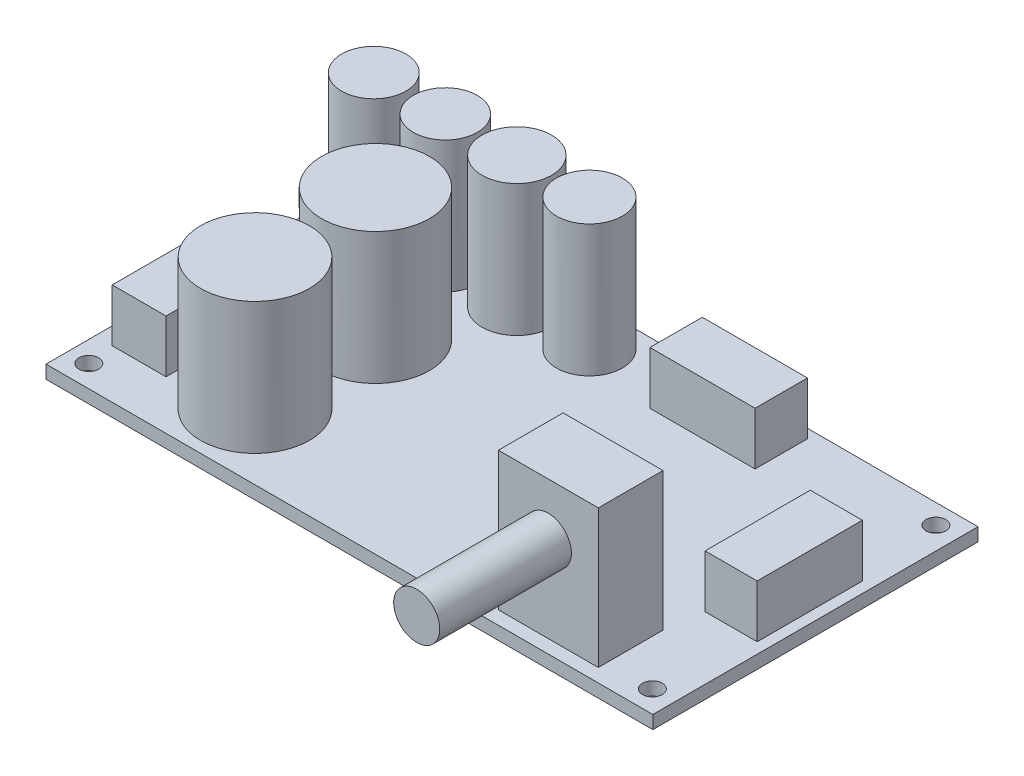
ISO-10303-21;
HEADER;
FILE_DESCRIPTION(('STEP AP214'),'2;1');
FILE_NAME('part.step','',(''),(''),'','','');
FILE_SCHEMA(('AUTOMOTIVE_DESIGN { 1 0 10303 214 1 1 1 1 }'));
ENDSEC;
DATA;
#1=APPLICATION_CONTEXT('core data for automotive mechanical design processes');
#2=APPLICATION_PROTOCOL_DEFINITION('international standard','automotive_design',2000,#1);
#3=PRODUCT_CONTEXT('',#1,'mechanical');
#4=PRODUCT('Part','Part','',(#3));
#5=PRODUCT_RELATED_PRODUCT_CATEGORY('part','',(#4));
#6=PRODUCT_DEFINITION_FORMATION('','',#4);
#7=PRODUCT_DEFINITION_CONTEXT('part definition',#1,'design');
#8=PRODUCT_DEFINITION('design','',#6,#7);
#9=PRODUCT_DEFINITION_SHAPE('','',#8);
#10=(LENGTH_UNIT() NAMED_UNIT(*) SI_UNIT(.MILLI.,.METRE.));
#11=(NAMED_UNIT(*) PLANE_ANGLE_UNIT() SI_UNIT($,.RADIAN.));
#12=(NAMED_UNIT(*) SI_UNIT($,.STERADIAN.) SOLID_ANGLE_UNIT());
#13=UNCERTAINTY_MEASURE_WITH_UNIT(LENGTH_MEASURE(1.E-05),#10,'distance_accuracy_value','');
#14=(GEOMETRIC_REPRESENTATION_CONTEXT(3) GLOBAL_UNCERTAINTY_ASSIGNED_CONTEXT((#13)) GLOBAL_UNIT_ASSIGNED_CONTEXT((#10,
#11,#12)) REPRESENTATION_CONTEXT('',''));
#15=CARTESIAN_POINT('',(0.,0.,0.));
#16=DIRECTION('',(0.,0.,1.));
#17=DIRECTION('',(1.,0.,0.));
#18=AXIS2_PLACEMENT_3D('',#15,#16,#17);
#19=CARTESIAN_POINT('',(0.,2.,0.));
#20=DIRECTION('',(0.,-1.,0.));
#21=DIRECTION('',(0.,0.,-1.));
#22=AXIS2_PLACEMENT_3D('',#19,#20,#21);
#23=PLANE('',#22);
#24=CARTESIAN_POINT('',(39.3032224539351,2.,-43.2596794848796));
#25=DIRECTION('',(0.,1.,0.));
#26=DIRECTION('',(0.,0.,1.));
#27=AXIS2_PLACEMENT_3D('',#24,#25,#26);
#28=CIRCLE('',#27,5.00626696308557);
#29=CARTESIAN_POINT('',(39.3032224539351,2.,-38.253412521794));
#30=VERTEX_POINT('',#29);
#31=EDGE_CURVE('E306',#30,#30,#28,.T.);
#32=ORIENTED_EDGE('',*,*,#31,.F.);
#33=EDGE_LOOP('',(#32));
#34=FACE_BOUND('',#33,.T.);
#35=CARTESIAN_POINT('',(28.275737120317,2.,-43.2596794848796));
#36=DIRECTION('',(0.,1.,0.));
#37=DIRECTION('',(0.,0.,1.));
#38=AXIS2_PLACEMENT_3D('',#35,#36,#37);
#39=CIRCLE('',#38,5.28960392137158);
#40=CARTESIAN_POINT('',(28.275737120317,2.,-37.970075563508));
#41=VERTEX_POINT('',#40);
#42=EDGE_CURVE('E309',#41,#41,#39,.T.);
#43=ORIENTED_EDGE('',*,*,#42,.F.);
#44=EDGE_LOOP('',(#43));
#45=FACE_BOUND('',#44,.T.);
#46=CARTESIAN_POINT('',(17.4088462333051,2.,-43.2596794848796));
#47=DIRECTION('',(0.,1.,0.));
#48=DIRECTION('',(0.,0.,1.));
#49=AXIS2_PLACEMENT_3D('',#46,#47,#48);
#50=CIRCLE('',#49,4.86636211814024);
#51=CARTESIAN_POINT('',(17.4088462333051,2.,-38.3933173667394));
#52=VERTEX_POINT('',#51);
#53=EDGE_CURVE('E312',#52,#52,#50,.T.);
#54=ORIENTED_EDGE('',*,*,#53,.F.);
#55=EDGE_LOOP('',(#54));
#56=FACE_BOUND('',#55,.T.);
#57=CARTESIAN_POINT('',(6.54195534629316,2.,-43.2596794848796));
#58=DIRECTION('',(0.,1.,0.));
#59=DIRECTION('',(0.,0.,1.));
#60=AXIS2_PLACEMENT_3D('',#57,#58,#59);
#61=CIRCLE('',#60,4.88663565414446);
#62=CARTESIAN_POINT('',(6.54195534629316,2.,-38.3730438307351));
#63=VERTEX_POINT('',#62);
#64=EDGE_CURVE('E315',#63,#63,#61,.T.);
#65=ORIENTED_EDGE('',*,*,#64,.F.);
#66=EDGE_LOOP('',(#65));
#67=FACE_BOUND('',#66,.T.);
#68=CARTESIAN_POINT('',(21.7941831917424,2.,-28.2648132629545));
#69=DIRECTION('',(0.,1.,0.));
#70=DIRECTION('',(0.,0.,1.));
#71=AXIS2_PLACEMENT_3D('',#68,#69,#70);
#72=CIRCLE('',#71,8.19285699774402);
#73=CARTESIAN_POINT('',(21.7941831917424,2.,-20.0719562652105));
#74=VERTEX_POINT('',#73);
#75=EDGE_CURVE('E318',#74,#74,#72,.T.);
#76=ORIENTED_EDGE('',*,*,#75,.F.);
#77=EDGE_LOOP('',(#76));
#78=FACE_BOUND('',#77,.T.);
#79=CARTESIAN_POINT('',(21.7941831917424,2.,-9.96047002436539));
#80=DIRECTION('',(0.,1.,0.));
#81=DIRECTION('',(0.,0.,1.));
#82=AXIS2_PLACEMENT_3D('',#79,#80,#81);
#83=CIRCLE('',#82,8.26216698803987);
#84=CARTESIAN_POINT('',(21.7941831917424,2.,-1.69830303632552));
#85=VERTEX_POINT('',#84);
#86=EDGE_CURVE('E321',#85,#85,#83,.T.);
#87=ORIENTED_EDGE('',*,*,#86,.F.);
#88=EDGE_LOOP('',(#87));
#89=FACE_BOUND('',#88,.T.);
#90=DIRECTION('',(0.,0.,1.));
#91=VECTOR('',#90,1.);
#92=CARTESIAN_POINT('',(82.64782543229,2.,-33.4703322658946));
#93=LINE('',#92,#91);
#94=CARTESIAN_POINT('',(82.64782543229,2.,-33.4703322658946));
#95=VERTEX_POINT('',#94);
#96=CARTESIAN_POINT('',(82.64782543229,2.,-17.4908386370606));
#97=VERTEX_POINT('',#96);
#98=EDGE_CURVE('E324',#95,#97,#93,.T.);
#99=ORIENTED_EDGE('',*,*,#98,.F.);
#100=DIRECTION('',(-1.,0.,0.));
#101=VECTOR('',#100,1.);
#102=CARTESIAN_POINT('',(82.64782543229,2.,-33.4703322658946));
#103=LINE('',#102,#101);
#104=CARTESIAN_POINT('',(90.5594965449374,2.,-33.4703322658946));
#105=VERTEX_POINT('',#104);
#106=EDGE_CURVE('E56',#105,#95,#103,.T.);
#107=ORIENTED_EDGE('',*,*,#106,.F.);
#108=DIRECTION('',(0.,0.,-1.));
#109=VECTOR('',#108,1.);
#110=CARTESIAN_POINT('',(90.5594965449374,2.,-33.4703322658946));
#111=LINE('',#110,#109);
#112=CARTESIAN_POINT('',(90.5594965449374,2.,-17.4908386370606));
#113=VERTEX_POINT('',#112);
#114=EDGE_CURVE('E330',#113,#105,#111,.T.);
#115=ORIENTED_EDGE('',*,*,#114,.F.);
#116=DIRECTION('',(1.,0.,0.));
#117=VECTOR('',#116,1.);
#118=CARTESIAN_POINT('',(82.64782543229,2.,-17.4908386370606));
#119=LINE('',#118,#117);
#120=EDGE_CURVE('E327',#97,#113,#119,.T.);
#121=ORIENTED_EDGE('',*,*,#120,.F.);
#122=EDGE_LOOP('',(#99,#107,#115,#121));
#123=FACE_BOUND('',#122,.T.);
#124=DIRECTION('',(0.,0.,1.));
#125=VECTOR('',#124,1.);
#126=CARTESIAN_POINT('',(2.61143252259727,2.,-23.6201436271693));
#127=LINE('',#126,#125);
#128=CARTESIAN_POINT('',(2.61143252259727,2.,-23.6201436271693));
#129=VERTEX_POINT('',#128);
#130=CARTESIAN_POINT('',(2.61143252259727,2.,-7.44690784271631));
#131=VERTEX_POINT('',#130);
#132=EDGE_CURVE('E345',#129,#131,#127,.T.);
#133=ORIENTED_EDGE('',*,*,#132,.F.);
#134=DIRECTION('',(-1.,0.,0.));
#135=VECTOR('',#134,1.);
#136=CARTESIAN_POINT('',(2.61143252259727,2.,-23.6201436271693));
#137=LINE('',#136,#135);
#138=CARTESIAN_POINT('',(10.7894984362221,2.,-23.6201436271693));
#139=VERTEX_POINT('',#138);
#140=EDGE_CURVE('E354',#139,#129,#137,.T.);
#141=ORIENTED_EDGE('',*,*,#140,.F.);
#142=DIRECTION('',(0.,0.,-1.));
#143=VECTOR('',#142,1.);
#144=CARTESIAN_POINT('',(10.7894984362221,2.,-23.6201436271693));
#145=LINE('',#144,#143);
#146=CARTESIAN_POINT('',(10.7894984362221,2.,-7.44690784271631));
#147=VERTEX_POINT('',#146);
#148=EDGE_CURVE('E351',#147,#139,#145,.T.);
#149=ORIENTED_EDGE('',*,*,#148,.F.);
#150=DIRECTION('',(1.,0.,0.));
#151=VECTOR('',#150,1.);
#152=CARTESIAN_POINT('',(2.61143252259727,2.,-7.44690784271631));
#153=LINE('',#152,#151);
#154=EDGE_CURVE('E348',#131,#147,#153,.T.);
#155=ORIENTED_EDGE('',*,*,#154,.F.);
#156=EDGE_LOOP('',(#133,#141,#149,#155));
#157=FACE_BOUND('',#156,.T.);
#158=DIRECTION('',(0.,0.,1.));
#159=VECTOR('',#158,1.);
#160=CARTESIAN_POINT('',(0.,2.,0.));
#161=LINE('',#160,#159);
#162=CARTESIAN_POINT('',(0.,2.,-49.4));
#163=VERTEX_POINT('',#162);
#164=CARTESIAN_POINT('',(0.,2.,0.));
#165=VERTEX_POINT('',#164);
#166=EDGE_CURVE('E376',#163,#165,#161,.T.);
#167=ORIENTED_EDGE('',*,*,#166,.T.);
#168=DIRECTION('',(1.,0.,0.));
#169=VECTOR('',#168,1.);
#170=CARTESIAN_POINT('',(0.,2.,0.));
#171=LINE('',#170,#169);
#172=CARTESIAN_POINT('',(92.2,2.,0.));
#173=VERTEX_POINT('',#172);
#174=EDGE_CURVE('E379',#165,#173,#171,.T.);
#175=ORIENTED_EDGE('',*,*,#174,.T.);
#176=DIRECTION('',(0.,0.,-1.));
#177=VECTOR('',#176,1.);
#178=CARTESIAN_POINT('',(92.2,2.,0.));
#179=LINE('',#178,#177);
#180=CARTESIAN_POINT('',(92.2,2.,-49.4));
#181=VERTEX_POINT('',#180);
#182=EDGE_CURVE('E382',#173,#181,#179,.T.);
#183=ORIENTED_EDGE('',*,*,#182,.T.);
#184=DIRECTION('',(-1.,0.,0.));
#185=VECTOR('',#184,1.);
#186=CARTESIAN_POINT('',(0.,2.,-49.4));
#187=LINE('',#186,#185);
#188=EDGE_CURVE('E384',#181,#163,#187,.T.);
#189=ORIENTED_EDGE('',*,*,#188,.T.);
#190=EDGE_LOOP('',(#167,#175,#183,#189));
#191=FACE_BOUND('',#190,.T.);
#192=CARTESIAN_POINT('',(3.17395868291502,2.,-3.33170554922467));
#193=DIRECTION('',(0.,1.,0.));
#194=DIRECTION('',(0.,0.,1.));
#195=AXIS2_PLACEMENT_3D('',#192,#193,#194);
#196=CIRCLE('',#195,1.5);
#197=CARTESIAN_POINT('',(3.17395868291502,2.,-1.83170554922467));
#198=VERTEX_POINT('',#197);
#199=EDGE_CURVE('E370',#198,#198,#196,.T.);
#200=ORIENTED_EDGE('',*,*,#199,.F.);
#201=EDGE_LOOP('',(#200));
#202=FACE_BOUND('',#201,.T.);
#203=CARTESIAN_POINT('',(88.7993970505717,2.,-46.4060095753167));
#204=DIRECTION('',(0.,1.,0.));
#205=DIRECTION('',(0.,0.,1.));
#206=AXIS2_PLACEMENT_3D('',#203,#204,#205);
#207=CIRCLE('',#206,1.5);
#208=CARTESIAN_POINT('',(88.7993970505717,2.,-44.9060095753167));
#209=VERTEX_POINT('',#208);
#210=EDGE_CURVE('E364',#209,#209,#207,.T.);
#211=ORIENTED_EDGE('',*,*,#210,.F.);
#212=EDGE_LOOP('',(#211));
#213=FACE_BOUND('',#212,.T.);
#214=CARTESIAN_POINT('',(88.7993970505717,2.,-3.33170554922467));
#215=DIRECTION('',(0.,1.,0.));
#216=DIRECTION('',(0.,0.,1.));
#217=AXIS2_PLACEMENT_3D('',#214,#215,#216);
#218=CIRCLE('',#217,1.5);
#219=CARTESIAN_POINT('',(88.7993970505717,2.,-1.83170554922467));
#220=VERTEX_POINT('',#219);
#221=EDGE_CURVE('E358',#220,#220,#218,.T.);
#222=ORIENTED_EDGE('',*,*,#221,.F.);
#223=EDGE_LOOP('',(#222));
#224=FACE_BOUND('',#223,.T.);
#225=DIRECTION('',(0.,0.,1.));
#226=VECTOR('',#225,1.);
#227=CARTESIAN_POINT('',(51.6901467301312,2.,-48.0224224645311));
#228=LINE('',#227,#226);
#229=CARTESIAN_POINT('',(51.6901467301312,2.,-48.0224224645311));
#230=VERTEX_POINT('',#229);
#231=CARTESIAN_POINT('',(51.6901467301312,2.,-40.06295574366));
#232=VERTEX_POINT('',#231);
#233=EDGE_CURVE('E333',#230,#232,#228,.T.);
#234=ORIENTED_EDGE('',*,*,#233,.F.);
#235=DIRECTION('',(-1.,0.,0.));
#236=VECTOR('',#235,1.);
#237=CARTESIAN_POINT('',(51.6901467301312,2.,-48.0224224645311));
#238=LINE('',#237,#236);
#239=CARTESIAN_POINT('',(67.6705432353549,2.,-48.0224224645311));
#240=VERTEX_POINT('',#239);
#241=EDGE_CURVE('E342',#240,#230,#238,.T.);
#242=ORIENTED_EDGE('',*,*,#241,.F.);
#243=DIRECTION('',(0.,0.,-1.));
#244=VECTOR('',#243,1.);
#245=CARTESIAN_POINT('',(67.6705432353549,2.,-48.0224224645311));
#246=LINE('',#245,#244);
#247=CARTESIAN_POINT('',(67.6705432353549,2.,-40.06295574366));
#248=VERTEX_POINT('',#247);
#249=EDGE_CURVE('E339',#248,#240,#246,.T.);
#250=ORIENTED_EDGE('',*,*,#249,.F.);
#251=DIRECTION('',(1.,0.,0.));
#252=VECTOR('',#251,1.);
#253=CARTESIAN_POINT('',(51.6901467301312,2.,-40.06295574366));
#254=LINE('',#253,#252);
#255=EDGE_CURVE('E336',#232,#248,#254,.T.);
#256=ORIENTED_EDGE('',*,*,#255,.F.);
#257=EDGE_LOOP('',(#234,#242,#250,#256));
#258=FACE_BOUND('',#257,.T.);
#259=DIRECTION('',(0.,0.,1.));
#260=VECTOR('',#259,1.);
#261=CARTESIAN_POINT('',(66.6968726537264,2.,-11.8685424395724));
#262=LINE('',#261,#260);
#263=CARTESIAN_POINT('',(66.6968726537264,2.,-11.8685424395724));
#264=VERTEX_POINT('',#263);
#265=CARTESIAN_POINT('',(66.6968726537264,2.,-2.03848519042144));
#266=VERTEX_POINT('',#265);
#267=EDGE_CURVE('E290',#264,#266,#262,.T.);
#268=ORIENTED_EDGE('',*,*,#267,.F.);
#269=DIRECTION('',(-1.,0.,0.));
#270=VECTOR('',#269,1.);
#271=CARTESIAN_POINT('',(66.6968726537264,2.,-11.8685424395724));
#272=LINE('',#271,#270);
#273=CARTESIAN_POINT('',(81.8744810464154,2.,-11.8685424395724));
#274=VERTEX_POINT('',#273);
#275=EDGE_CURVE('E48',#274,#264,#272,.T.);
#276=ORIENTED_EDGE('',*,*,#275,.F.);
#277=DIRECTION('',(0.,0.,-1.));
#278=VECTOR('',#277,1.);
#279=CARTESIAN_POINT('',(81.8744810464154,2.,-11.8685424395724));
#280=LINE('',#279,#278);
#281=CARTESIAN_POINT('',(81.8744810464154,2.,-2.03848519042144));
#282=VERTEX_POINT('',#281);
#283=EDGE_CURVE('E303',#282,#274,#280,.T.);
#284=ORIENTED_EDGE('',*,*,#283,.F.);
#285=DIRECTION('',(1.,0.,0.));
#286=VECTOR('',#285,1.);
#287=CARTESIAN_POINT('',(66.6968726537264,2.,-2.03848519042144));
#288=LINE('',#287,#286);
#289=EDGE_CURVE('E300',#266,#282,#288,.T.);
#290=ORIENTED_EDGE('',*,*,#289,.F.);
#291=EDGE_LOOP('',(#268,#276,#284,#290));
#292=FACE_BOUND('',#291,.T.);
#293=ADVANCED_FACE('F33',(#34,#45,#56,#67,#78,#89,#123,#157,#191,#202,#213,#224,#258,#292),#23,.F.);
#294=CARTESIAN_POINT('',(0.,0.,0.));
#295=DIRECTION('',(0.,-1.,0.));
#296=DIRECTION('',(0.,0.,-1.));
#297=AXIS2_PLACEMENT_3D('',#294,#295,#296);
#298=PLANE('',#297);
#299=CARTESIAN_POINT('',(88.7993970505717,0.,-46.4060095753167));
#300=DIRECTION('',(0.,1.,0.));
#301=DIRECTION('',(0.,0.,1.));
#302=AXIS2_PLACEMENT_3D('',#299,#300,#301);
#303=CIRCLE('',#302,1.5);
#304=CARTESIAN_POINT('',(88.7993970505717,0.,-44.9060095753167));
#305=VERTEX_POINT('',#304);
#306=EDGE_CURVE('E361',#305,#305,#303,.T.);
#307=ORIENTED_EDGE('',*,*,#306,.T.);
#308=EDGE_LOOP('',(#307));
#309=FACE_BOUND('',#308,.T.);
#310=DIRECTION('',(0.,0.,1.));
#311=VECTOR('',#310,1.);
#312=CARTESIAN_POINT('',(0.,0.,0.));
#313=LINE('',#312,#311);
#314=CARTESIAN_POINT('',(0.,0.,-49.4));
#315=VERTEX_POINT('',#314);
#316=CARTESIAN_POINT('',(0.,0.,0.));
#317=VERTEX_POINT('',#316);
#318=EDGE_CURVE('E373',#315,#317,#313,.T.);
#319=ORIENTED_EDGE('',*,*,#318,.F.);
#320=DIRECTION('',(-1.,0.,0.));
#321=VECTOR('',#320,1.);
#322=CARTESIAN_POINT('',(0.,0.,-49.4));
#323=LINE('',#322,#321);
#324=CARTESIAN_POINT('',(92.2,0.,-49.4));
#325=VERTEX_POINT('',#324);
#326=EDGE_CURVE('E380',#325,#315,#323,.T.);
#327=ORIENTED_EDGE('',*,*,#326,.F.);
#328=DIRECTION('',(0.,0.,-1.));
#329=VECTOR('',#328,1.);
#330=CARTESIAN_POINT('',(92.2,0.,0.));
#331=LINE('',#330,#329);
#332=CARTESIAN_POINT('',(92.2,0.,0.));
#333=VERTEX_POINT('',#332);
#334=EDGE_CURVE('E391',#333,#325,#331,.T.);
#335=ORIENTED_EDGE('',*,*,#334,.F.);
#336=DIRECTION('',(1.,0.,0.));
#337=VECTOR('',#336,1.);
#338=CARTESIAN_POINT('',(0.,0.,0.));
#339=LINE('',#338,#337);
#340=EDGE_CURVE('E389',#317,#333,#339,.T.);
#341=ORIENTED_EDGE('',*,*,#340,.F.);
#342=EDGE_LOOP('',(#319,#327,#335,#341));
#343=FACE_BOUND('',#342,.T.);
#344=CARTESIAN_POINT('',(3.17395868291502,0.,-3.33170554922467));
#345=DIRECTION('',(0.,1.,0.));
#346=DIRECTION('',(0.,0.,1.));
#347=AXIS2_PLACEMENT_3D('',#344,#345,#346);
#348=CIRCLE('',#347,1.5);
#349=CARTESIAN_POINT('',(3.17395868291502,0.,-1.83170554922467));
#350=VERTEX_POINT('',#349);
#351=EDGE_CURVE('E367',#350,#350,#348,.T.);
#352=ORIENTED_EDGE('',*,*,#351,.T.);
#353=EDGE_LOOP('',(#352));
#354=FACE_BOUND('',#353,.T.);
#355=CARTESIAN_POINT('',(88.7993970505717,0.,-3.33170554922467));
#356=DIRECTION('',(0.,1.,0.));
#357=DIRECTION('',(0.,0.,1.));
#358=AXIS2_PLACEMENT_3D('',#355,#356,#357);
#359=CIRCLE('',#358,1.5);
#360=CARTESIAN_POINT('',(88.7993970505717,0.,-1.83170554922467));
#361=VERTEX_POINT('',#360);
#362=EDGE_CURVE('E357',#361,#361,#359,.T.);
#363=ORIENTED_EDGE('',*,*,#362,.T.);
#364=EDGE_LOOP('',(#363));
#365=FACE_BOUND('',#364,.T.);
#366=ADVANCED_FACE('F409',(#309,#343,#354,#365),#298,.T.);
#367=CARTESIAN_POINT('',(0.,2.,0.));
#368=DIRECTION('',(1.,0.,0.));
#369=DIRECTION('',(0.,0.,-1.));
#370=AXIS2_PLACEMENT_3D('',#367,#368,#369);
#371=PLANE('',#370);
#372=ORIENTED_EDGE('',*,*,#318,.T.);
#373=DIRECTION('',(0.,-1.,0.));
#374=VECTOR('',#373,1.);
#375=CARTESIAN_POINT('',(0.,2.,0.));
#376=LINE('',#375,#374);
#377=EDGE_CURVE('E11',#165,#317,#376,.T.);
#378=ORIENTED_EDGE('',*,*,#377,.F.);
#379=ORIENTED_EDGE('',*,*,#166,.F.);
#380=DIRECTION('',(0.,-1.,0.));
#381=VECTOR('',#380,1.);
#382=CARTESIAN_POINT('',(0.,2.,-49.4));
#383=LINE('',#382,#381);
#384=EDGE_CURVE('E386',#163,#315,#383,.T.);
#385=ORIENTED_EDGE('',*,*,#384,.T.);
#386=EDGE_LOOP('',(#372,#378,#379,#385));
#387=FACE_BOUND('',#386,.T.);
#388=ADVANCED_FACE('F35',(#387),#371,.F.);
#389=CARTESIAN_POINT('',(0.,2.,0.));
#390=DIRECTION('',(0.,0.,-1.));
#391=DIRECTION('',(-1.,0.,0.));
#392=AXIS2_PLACEMENT_3D('',#389,#390,#391);
#393=PLANE('',#392);
#394=ORIENTED_EDGE('',*,*,#340,.T.);
#395=DIRECTION('',(0.,-1.,0.));
#396=VECTOR('',#395,1.);
#397=CARTESIAN_POINT('',(92.2,2.,0.));
#398=LINE('',#397,#396);
#399=EDGE_CURVE('E41',#173,#333,#398,.T.);
#400=ORIENTED_EDGE('',*,*,#399,.F.);
#401=ORIENTED_EDGE('',*,*,#174,.F.);
#402=ORIENTED_EDGE('',*,*,#377,.T.);
#403=EDGE_LOOP('',(#394,#400,#401,#402));
#404=FACE_BOUND('',#403,.T.);
#405=ADVANCED_FACE('F420',(#404),#393,.F.);
#406=CARTESIAN_POINT('',(92.2,2.,0.));
#407=DIRECTION('',(-1.,0.,0.));
#408=DIRECTION('',(0.,0.,1.));
#409=AXIS2_PLACEMENT_3D('',#406,#407,#408);
#410=PLANE('',#409);
#411=ORIENTED_EDGE('',*,*,#334,.T.);
#412=DIRECTION('',(0.,-1.,0.));
#413=VECTOR('',#412,1.);
#414=CARTESIAN_POINT('',(92.2,2.,-49.4));
#415=LINE('',#414,#413);
#416=EDGE_CURVE('E396',#181,#325,#415,.T.);
#417=ORIENTED_EDGE('',*,*,#416,.F.);
#418=ORIENTED_EDGE('',*,*,#182,.F.);
#419=ORIENTED_EDGE('',*,*,#399,.T.);
#420=EDGE_LOOP('',(#411,#417,#418,#419));
#421=FACE_BOUND('',#420,.T.);
#422=ADVANCED_FACE('F403',(#421),#410,.F.);
#423=CARTESIAN_POINT('',(0.,2.,-49.4));
#424=DIRECTION('',(0.,0.,1.));
#425=DIRECTION('',(1.,0.,0.));
#426=AXIS2_PLACEMENT_3D('',#423,#424,#425);
#427=PLANE('',#426);
#428=ORIENTED_EDGE('',*,*,#326,.T.);
#429=ORIENTED_EDGE('',*,*,#384,.F.);
#430=ORIENTED_EDGE('',*,*,#188,.F.);
#431=ORIENTED_EDGE('',*,*,#416,.T.);
#432=EDGE_LOOP('',(#428,#429,#430,#431));
#433=FACE_BOUND('',#432,.T.);
#434=ADVANCED_FACE('F413',(#433),#427,.F.);
#435=CARTESIAN_POINT('',(3.17395868291502,2.,-3.33170554922467));
#436=DIRECTION('',(0.,-1.,0.));
#437=DIRECTION('',(0.,0.,-1.));
#438=AXIS2_PLACEMENT_3D('',#435,#436,#437);
#439=CYLINDRICAL_SURFACE('',#438,1.5);
#440=ORIENTED_EDGE('',*,*,#199,.T.);
#441=EDGE_LOOP('',(#440));
#442=FACE_BOUND('',#441,.T.);
#443=ORIENTED_EDGE('',*,*,#351,.F.);
#444=EDGE_LOOP('',(#443));
#445=FACE_BOUND('',#444,.T.);
#446=ADVANCED_FACE('F438',(#442,#445),#439,.F.);
#447=CARTESIAN_POINT('',(88.7993970505717,2.,-46.4060095753167));
#448=DIRECTION('',(0.,-1.,0.));
#449=DIRECTION('',(0.,0.,-1.));
#450=AXIS2_PLACEMENT_3D('',#447,#448,#449);
#451=CYLINDRICAL_SURFACE('',#450,1.5);
#452=ORIENTED_EDGE('',*,*,#210,.T.);
#453=EDGE_LOOP('',(#452));
#454=FACE_BOUND('',#453,.T.);
#455=ORIENTED_EDGE('',*,*,#306,.F.);
#456=EDGE_LOOP('',(#455));
#457=FACE_BOUND('',#456,.T.);
#458=ADVANCED_FACE('F445',(#454,#457),#451,.F.);
#459=CARTESIAN_POINT('',(88.7993970505717,2.,-3.33170554922467));
#460=DIRECTION('',(0.,-1.,0.));
#461=DIRECTION('',(0.,0.,-1.));
#462=AXIS2_PLACEMENT_3D('',#459,#460,#461);
#463=CYLINDRICAL_SURFACE('',#462,1.5);
#464=ORIENTED_EDGE('',*,*,#221,.T.);
#465=EDGE_LOOP('',(#464));
#466=FACE_BOUND('',#465,.T.);
#467=ORIENTED_EDGE('',*,*,#362,.F.);
#468=EDGE_LOOP('',(#467));
#469=FACE_BOUND('',#468,.T.);
#470=ADVANCED_FACE('F450',(#466,#469),#463,.F.);
#471=CARTESIAN_POINT('',(2.61143252259727,10.,-7.44690784271631));
#472=DIRECTION('',(0.,0.,1.));
#473=DIRECTION('',(1.,0.,0.));
#474=AXIS2_PLACEMENT_3D('',#471,#472,#473);
#475=PLANE('',#474);
#476=ORIENTED_EDGE('',*,*,#154,.T.);
#477=DIRECTION('',(0.,-1.,0.));
#478=VECTOR('',#477,1.);
#479=CARTESIAN_POINT('',(10.7894984362221,10.,-7.44690784271631));
#480=LINE('',#479,#478);
#481=CARTESIAN_POINT('',(10.7894984362221,10.,-7.44690784271631));
#482=VERTEX_POINT('',#481);
#483=EDGE_CURVE('E291',#482,#147,#480,.T.);
#484=ORIENTED_EDGE('',*,*,#483,.F.);
#485=DIRECTION('',(-1.,0.,0.));
#486=VECTOR('',#485,1.);
#487=CARTESIAN_POINT('',(2.61143252259727,10.,-7.44690784271631));
#488=LINE('',#487,#486);
#489=CARTESIAN_POINT('',(2.61143252259727,10.,-7.44690784271631));
#490=VERTEX_POINT('',#489);
#491=EDGE_CURVE('E283',#482,#490,#488,.T.);
#492=ORIENTED_EDGE('',*,*,#491,.T.);
#493=DIRECTION('',(0.,-1.,0.));
#494=VECTOR('',#493,1.);
#495=CARTESIAN_POINT('',(2.61143252259727,10.,-7.44690784271631));
#496=LINE('',#495,#494);
#497=EDGE_CURVE('E287',#490,#131,#496,.T.);
#498=ORIENTED_EDGE('',*,*,#497,.T.);
#499=EDGE_LOOP('',(#476,#484,#492,#498));
#500=FACE_BOUND('',#499,.T.);
#501=ADVANCED_FACE('F459',(#500),#475,.T.);
#502=CARTESIAN_POINT('',(2.61143252259727,10.,-23.6201436271693));
#503=DIRECTION('',(0.,0.,-1.));
#504=DIRECTION('',(-1.,0.,0.));
#505=AXIS2_PLACEMENT_3D('',#502,#503,#504);
#506=PLANE('',#505);
#507=ORIENTED_EDGE('',*,*,#140,.T.);
#508=DIRECTION('',(0.,-1.,0.));
#509=VECTOR('',#508,1.);
#510=CARTESIAN_POINT('',(2.61143252259727,10.,-23.6201436271693));
#511=LINE('',#510,#509);
#512=CARTESIAN_POINT('',(2.61143252259727,10.,-23.6201436271693));
#513=VERTEX_POINT('',#512);
#514=EDGE_CURVE('E286',#513,#129,#511,.T.);
#515=ORIENTED_EDGE('',*,*,#514,.F.);
#516=DIRECTION('',(1.,0.,0.));
#517=VECTOR('',#516,1.);
#518=CARTESIAN_POINT('',(2.61143252259727,10.,-23.6201436271693));
#519=LINE('',#518,#517);
#520=CARTESIAN_POINT('',(10.7894984362221,10.,-23.6201436271693));
#521=VERTEX_POINT('',#520);
#522=EDGE_CURVE('E277',#513,#521,#519,.T.);
#523=ORIENTED_EDGE('',*,*,#522,.T.);
#524=DIRECTION('',(0.,-1.,0.));
#525=VECTOR('',#524,1.);
#526=CARTESIAN_POINT('',(10.7894984362221,10.,-23.6201436271693));
#527=LINE('',#526,#525);
#528=EDGE_CURVE('E294',#521,#139,#527,.T.);
#529=ORIENTED_EDGE('',*,*,#528,.T.);
#530=EDGE_LOOP('',(#507,#515,#523,#529));
#531=FACE_BOUND('',#530,.T.);
#532=ADVANCED_FACE('F465',(#531),#506,.T.);
#533=CARTESIAN_POINT('',(2.61143252259727,10.,-7.44690784271631));
#534=DIRECTION('',(-1.,0.,0.));
#535=DIRECTION('',(0.,0.,1.));
#536=AXIS2_PLACEMENT_3D('',#533,#534,#535);
#537=PLANE('',#536);
#538=ORIENTED_EDGE('',*,*,#132,.T.);
#539=ORIENTED_EDGE('',*,*,#497,.F.);
#540=DIRECTION('',(0.,0.,-1.));
#541=VECTOR('',#540,1.);
#542=CARTESIAN_POINT('',(2.61143252259727,10.,-7.44690784271631));
#543=LINE('',#542,#541);
#544=EDGE_CURVE('E266',#490,#513,#543,.T.);
#545=ORIENTED_EDGE('',*,*,#544,.T.);
#546=ORIENTED_EDGE('',*,*,#514,.T.);
#547=EDGE_LOOP('',(#538,#539,#545,#546));
#548=FACE_BOUND('',#547,.T.);
#549=ADVANCED_FACE('F469',(#548),#537,.T.);
#550=CARTESIAN_POINT('',(10.7894984362221,10.,-7.44690784271631));
#551=DIRECTION('',(1.,0.,0.));
#552=DIRECTION('',(0.,0.,-1.));
#553=AXIS2_PLACEMENT_3D('',#550,#551,#552);
#554=PLANE('',#553);
#555=ORIENTED_EDGE('',*,*,#148,.T.);
#556=ORIENTED_EDGE('',*,*,#528,.F.);
#557=DIRECTION('',(0.,0.,1.));
#558=VECTOR('',#557,1.);
#559=CARTESIAN_POINT('',(10.7894984362221,10.,-7.44690784271631));
#560=LINE('',#559,#558);
#561=EDGE_CURVE('E280',#521,#482,#560,.T.);
#562=ORIENTED_EDGE('',*,*,#561,.T.);
#563=ORIENTED_EDGE('',*,*,#483,.T.);
#564=EDGE_LOOP('',(#555,#556,#562,#563));
#565=FACE_BOUND('',#564,.T.);
#566=ADVANCED_FACE('F472',(#565),#554,.T.);
#567=CARTESIAN_POINT('',(0.,10.,0.));
#568=DIRECTION('',(0.,-1.,0.));
#569=DIRECTION('',(0.,0.,-1.));
#570=AXIS2_PLACEMENT_3D('',#567,#568,#569);
#571=PLANE('',#570);
#572=ORIENTED_EDGE('',*,*,#544,.F.);
#573=ORIENTED_EDGE('',*,*,#491,.F.);
#574=ORIENTED_EDGE('',*,*,#561,.F.);
#575=ORIENTED_EDGE('',*,*,#522,.F.);
#576=EDGE_LOOP('',(#572,#573,#574,#575));
#577=FACE_BOUND('',#576,.T.);
#578=ADVANCED_FACE('F478',(#577),#571,.F.);
#579=CARTESIAN_POINT('',(51.6901467301312,10.,-40.06295574366));
#580=DIRECTION('',(0.,0.,1.));
#581=DIRECTION('',(1.,0.,0.));
#582=AXIS2_PLACEMENT_3D('',#579,#580,#581);
#583=PLANE('',#582);
#584=ORIENTED_EDGE('',*,*,#255,.T.);
#585=DIRECTION('',(0.,-1.,0.));
#586=VECTOR('',#585,1.);
#587=CARTESIAN_POINT('',(67.6705432353549,10.,-40.06295574366));
#588=LINE('',#587,#586);
#589=CARTESIAN_POINT('',(67.6705432353549,10.,-40.06295574366));
#590=VERTEX_POINT('',#589);
#591=EDGE_CURVE('E267',#590,#248,#588,.T.);
#592=ORIENTED_EDGE('',*,*,#591,.F.);
#593=DIRECTION('',(-1.,0.,0.));
#594=VECTOR('',#593,1.);
#595=CARTESIAN_POINT('',(51.6901467301312,10.,-40.06295574366));
#596=LINE('',#595,#594);
#597=CARTESIAN_POINT('',(51.6901467301312,10.,-40.06295574366));
#598=VERTEX_POINT('',#597);
#599=EDGE_CURVE('E259',#590,#598,#596,.T.);
#600=ORIENTED_EDGE('',*,*,#599,.T.);
#601=DIRECTION('',(0.,-1.,0.));
#602=VECTOR('',#601,1.);
#603=CARTESIAN_POINT('',(51.6901467301312,10.,-40.06295574366));
#604=LINE('',#603,#602);
#605=EDGE_CURVE('E263',#598,#232,#604,.T.);
#606=ORIENTED_EDGE('',*,*,#605,.T.);
#607=EDGE_LOOP('',(#584,#592,#600,#606));
#608=FACE_BOUND('',#607,.T.);
#609=ADVANCED_FACE('F483',(#608),#583,.T.);
#610=CARTESIAN_POINT('',(51.6901467301312,10.,-48.0224224645311));
#611=DIRECTION('',(0.,0.,-1.));
#612=DIRECTION('',(-1.,0.,0.));
#613=AXIS2_PLACEMENT_3D('',#610,#611,#612);
#614=PLANE('',#613);
#615=ORIENTED_EDGE('',*,*,#241,.T.);
#616=DIRECTION('',(0.,-1.,0.));
#617=VECTOR('',#616,1.);
#618=CARTESIAN_POINT('',(51.6901467301312,10.,-48.0224224645311));
#619=LINE('',#618,#617);
#620=CARTESIAN_POINT('',(51.6901467301312,10.,-48.0224224645311));
#621=VERTEX_POINT('',#620);
#622=EDGE_CURVE('E262',#621,#230,#619,.T.);
#623=ORIENTED_EDGE('',*,*,#622,.F.);
#624=DIRECTION('',(1.,0.,0.));
#625=VECTOR('',#624,1.);
#626=CARTESIAN_POINT('',(51.6901467301312,10.,-48.0224224645311));
#627=LINE('',#626,#625);
#628=CARTESIAN_POINT('',(67.6705432353549,10.,-48.0224224645311));
#629=VERTEX_POINT('',#628);
#630=EDGE_CURVE('E253',#621,#629,#627,.T.);
#631=ORIENTED_EDGE('',*,*,#630,.T.);
#632=DIRECTION('',(0.,-1.,0.));
#633=VECTOR('',#632,1.);
#634=CARTESIAN_POINT('',(67.6705432353549,10.,-48.0224224645311));
#635=LINE('',#634,#633);
#636=EDGE_CURVE('E270',#629,#240,#635,.T.);
#637=ORIENTED_EDGE('',*,*,#636,.T.);
#638=EDGE_LOOP('',(#615,#623,#631,#637));
#639=FACE_BOUND('',#638,.T.);
#640=ADVANCED_FACE('F489',(#639),#614,.T.);
#641=CARTESIAN_POINT('',(51.6901467301312,10.,-40.06295574366));
#642=DIRECTION('',(-1.,0.,0.));
#643=DIRECTION('',(0.,0.,1.));
#644=AXIS2_PLACEMENT_3D('',#641,#642,#643);
#645=PLANE('',#644);
#646=ORIENTED_EDGE('',*,*,#233,.T.);
#647=ORIENTED_EDGE('',*,*,#605,.F.);
#648=DIRECTION('',(0.,0.,-1.));
#649=VECTOR('',#648,1.);
#650=CARTESIAN_POINT('',(51.6901467301312,10.,-40.06295574366));
#651=LINE('',#650,#649);
#652=EDGE_CURVE('E242',#598,#621,#651,.T.);
#653=ORIENTED_EDGE('',*,*,#652,.T.);
#654=ORIENTED_EDGE('',*,*,#622,.T.);
#655=EDGE_LOOP('',(#646,#647,#653,#654));
#656=FACE_BOUND('',#655,.T.);
#657=ADVANCED_FACE('F485',(#656),#645,.T.);
#658=CARTESIAN_POINT('',(67.6705432353549,10.,-40.06295574366));
#659=DIRECTION('',(1.,0.,0.));
#660=DIRECTION('',(0.,0.,-1.));
#661=AXIS2_PLACEMENT_3D('',#658,#659,#660);
#662=PLANE('',#661);
#663=ORIENTED_EDGE('',*,*,#249,.T.);
#664=ORIENTED_EDGE('',*,*,#636,.F.);
#665=DIRECTION('',(0.,0.,1.));
#666=VECTOR('',#665,1.);
#667=CARTESIAN_POINT('',(67.6705432353549,10.,-40.06295574366));
#668=LINE('',#667,#666);
#669=EDGE_CURVE('E256',#629,#590,#668,.T.);
#670=ORIENTED_EDGE('',*,*,#669,.T.);
#671=ORIENTED_EDGE('',*,*,#591,.T.);
#672=EDGE_LOOP('',(#663,#664,#670,#671));
#673=FACE_BOUND('',#672,.T.);
#674=ADVANCED_FACE('F488',(#673),#662,.T.);
#675=CARTESIAN_POINT('',(0.,10.,0.));
#676=DIRECTION('',(0.,-1.,0.));
#677=DIRECTION('',(0.,0.,-1.));
#678=AXIS2_PLACEMENT_3D('',#675,#676,#677);
#679=PLANE('',#678);
#680=ORIENTED_EDGE('',*,*,#652,.F.);
#681=ORIENTED_EDGE('',*,*,#599,.F.);
#682=ORIENTED_EDGE('',*,*,#669,.F.);
#683=ORIENTED_EDGE('',*,*,#630,.F.);
#684=EDGE_LOOP('',(#680,#681,#682,#683));
#685=FACE_BOUND('',#684,.T.);
#686=ADVANCED_FACE('F496',(#685),#679,.F.);
#687=CARTESIAN_POINT('',(82.64782543229,10.,-17.4908386370606));
#688=DIRECTION('',(0.,0.,1.));
#689=DIRECTION('',(1.,0.,0.));
#690=AXIS2_PLACEMENT_3D('',#687,#688,#689);
#691=PLANE('',#690);
#692=ORIENTED_EDGE('',*,*,#120,.T.);
#693=DIRECTION('',(0.,-1.,0.));
#694=VECTOR('',#693,1.);
#695=CARTESIAN_POINT('',(90.5594965449374,10.,-17.4908386370606));
#696=LINE('',#695,#694);
#697=CARTESIAN_POINT('',(90.5594965449374,10.,-17.4908386370606));
#698=VERTEX_POINT('',#697);
#699=EDGE_CURVE('E243',#698,#113,#696,.T.);
#700=ORIENTED_EDGE('',*,*,#699,.F.);
#701=DIRECTION('',(-1.,0.,0.));
#702=VECTOR('',#701,1.);
#703=CARTESIAN_POINT('',(82.64782543229,10.,-17.4908386370606));
#704=LINE('',#703,#702);
#705=CARTESIAN_POINT('',(82.64782543229,10.,-17.4908386370606));
#706=VERTEX_POINT('',#705);
#707=EDGE_CURVE('E235',#698,#706,#704,.T.);
#708=ORIENTED_EDGE('',*,*,#707,.T.);
#709=DIRECTION('',(0.,-1.,0.));
#710=VECTOR('',#709,1.);
#711=CARTESIAN_POINT('',(82.64782543229,10.,-17.4908386370606));
#712=LINE('',#711,#710);
#713=EDGE_CURVE('E239',#706,#97,#712,.T.);
#714=ORIENTED_EDGE('',*,*,#713,.T.);
#715=EDGE_LOOP('',(#692,#700,#708,#714));
#716=FACE_BOUND('',#715,.T.);
#717=ADVANCED_FACE('F503',(#716),#691,.T.);
#718=CARTESIAN_POINT('',(82.64782543229,10.,-33.4703322658946));
#719=DIRECTION('',(0.,0.,-1.));
#720=DIRECTION('',(-1.,0.,0.));
#721=AXIS2_PLACEMENT_3D('',#718,#719,#720);
#722=PLANE('',#721);
#723=ORIENTED_EDGE('',*,*,#106,.T.);
#724=DIRECTION('',(0.,-1.,0.));
#725=VECTOR('',#724,1.);
#726=CARTESIAN_POINT('',(82.64782543229,10.,-33.4703322658946));
#727=LINE('',#726,#725);
#728=CARTESIAN_POINT('',(82.64782543229,10.,-33.4703322658946));
#729=VERTEX_POINT('',#728);
#730=EDGE_CURVE('E238',#729,#95,#727,.T.);
#731=ORIENTED_EDGE('',*,*,#730,.F.);
#732=DIRECTION('',(1.,0.,0.));
#733=VECTOR('',#732,1.);
#734=CARTESIAN_POINT('',(82.64782543229,10.,-33.4703322658946));
#735=LINE('',#734,#733);
#736=CARTESIAN_POINT('',(90.5594965449374,10.,-33.4703322658946));
#737=VERTEX_POINT('',#736);
#738=EDGE_CURVE('E229',#729,#737,#735,.T.);
#739=ORIENTED_EDGE('',*,*,#738,.T.);
#740=DIRECTION('',(0.,-1.,0.));
#741=VECTOR('',#740,1.);
#742=CARTESIAN_POINT('',(90.5594965449374,10.,-33.4703322658946));
#743=LINE('',#742,#741);
#744=EDGE_CURVE('E246',#737,#105,#743,.T.);
#745=ORIENTED_EDGE('',*,*,#744,.T.);
#746=EDGE_LOOP('',(#723,#731,#739,#745));
#747=FACE_BOUND('',#746,.T.);
#748=ADVANCED_FACE('F509',(#747),#722,.T.);
#749=CARTESIAN_POINT('',(82.64782543229,10.,-17.4908386370606));
#750=DIRECTION('',(-1.,0.,0.));
#751=DIRECTION('',(0.,0.,1.));
#752=AXIS2_PLACEMENT_3D('',#749,#750,#751);
#753=PLANE('',#752);
#754=ORIENTED_EDGE('',*,*,#98,.T.);
#755=ORIENTED_EDGE('',*,*,#713,.F.);
#756=DIRECTION('',(0.,0.,-1.));
#757=VECTOR('',#756,1.);
#758=CARTESIAN_POINT('',(82.64782543229,10.,-17.4908386370606));
#759=LINE('',#758,#757);
#760=EDGE_CURVE('E226',#706,#729,#759,.T.);
#761=ORIENTED_EDGE('',*,*,#760,.T.);
#762=ORIENTED_EDGE('',*,*,#730,.T.);
#763=EDGE_LOOP('',(#754,#755,#761,#762));
#764=FACE_BOUND('',#763,.T.);
#765=ADVANCED_FACE('F505',(#764),#753,.T.);
#766=CARTESIAN_POINT('',(90.5594965449374,10.,-17.4908386370606));
#767=DIRECTION('',(1.,0.,0.));
#768=DIRECTION('',(0.,0.,-1.));
#769=AXIS2_PLACEMENT_3D('',#766,#767,#768);
#770=PLANE('',#769);
#771=ORIENTED_EDGE('',*,*,#114,.T.);
#772=ORIENTED_EDGE('',*,*,#744,.F.);
#773=DIRECTION('',(0.,0.,1.));
#774=VECTOR('',#773,1.);
#775=CARTESIAN_POINT('',(90.5594965449374,10.,-17.4908386370606));
#776=LINE('',#775,#774);
#777=EDGE_CURVE('E232',#737,#698,#776,.T.);
#778=ORIENTED_EDGE('',*,*,#777,.T.);
#779=ORIENTED_EDGE('',*,*,#699,.T.);
#780=EDGE_LOOP('',(#771,#772,#778,#779));
#781=FACE_BOUND('',#780,.T.);
#782=ADVANCED_FACE('F508',(#781),#770,.T.);
#783=CARTESIAN_POINT('',(0.,10.,0.));
#784=DIRECTION('',(0.,-1.,0.));
#785=DIRECTION('',(0.,0.,-1.));
#786=AXIS2_PLACEMENT_3D('',#783,#784,#785);
#787=PLANE('',#786);
#788=ORIENTED_EDGE('',*,*,#760,.F.);
#789=ORIENTED_EDGE('',*,*,#707,.F.);
#790=ORIENTED_EDGE('',*,*,#777,.F.);
#791=ORIENTED_EDGE('',*,*,#738,.F.);
#792=EDGE_LOOP('',(#788,#789,#790,#791));
#793=FACE_BOUND('',#792,.T.);
#794=ADVANCED_FACE('F516',(#793),#787,.F.);
#795=CARTESIAN_POINT('',(21.7941831917424,22.,-28.2648132629545));
#796=DIRECTION('',(0.,-1.,0.));
#797=DIRECTION('',(0.,0.,-1.));
#798=AXIS2_PLACEMENT_3D('',#795,#796,#797);
#799=CYLINDRICAL_SURFACE('',#798,8.19285699774402);
#800=CARTESIAN_POINT('',(21.7941831917424,22.,-28.2648132629545));
#801=DIRECTION('',(0.,-1.,0.));
#802=DIRECTION('',(0.,0.,-1.));
#803=AXIS2_PLACEMENT_3D('',#800,#801,#802);
#804=CIRCLE('',#803,8.19285699774402);
#805=CARTESIAN_POINT('',(21.7941831917424,22.,-36.4576702606985));
#806=VERTEX_POINT('',#805);
#807=EDGE_CURVE('E223',#806,#806,#804,.T.);
#808=ORIENTED_EDGE('',*,*,#807,.T.);
#809=EDGE_LOOP('',(#808));
#810=FACE_BOUND('',#809,.T.);
#811=ORIENTED_EDGE('',*,*,#75,.T.);
#812=EDGE_LOOP('',(#811));
#813=FACE_BOUND('',#812,.T.);
#814=ADVANCED_FACE('F523',(#810,#813),#799,.T.);
#815=CARTESIAN_POINT('',(21.7941831917424,22.,-28.2648132629545));
#816=DIRECTION('',(0.,-1.,0.));
#817=DIRECTION('',(0.,0.,-1.));
#818=AXIS2_PLACEMENT_3D('',#815,#816,#817);
#819=PLANE('',#818);
#820=ORIENTED_EDGE('',*,*,#807,.F.);
#821=EDGE_LOOP('',(#820));
#822=FACE_BOUND('',#821,.T.);
#823=ADVANCED_FACE('F527',(#822),#819,.F.);
#824=CARTESIAN_POINT('',(21.7941831917424,22.,-9.96047002436539));
#825=DIRECTION('',(0.,-1.,0.));
#826=DIRECTION('',(0.,0.,-1.));
#827=AXIS2_PLACEMENT_3D('',#824,#825,#826);
#828=CYLINDRICAL_SURFACE('',#827,8.26216698803987);
#829=CARTESIAN_POINT('',(21.7941831917424,22.,-9.96047002436539));
#830=DIRECTION('',(0.,-1.,0.));
#831=DIRECTION('',(0.,0.,-1.));
#832=AXIS2_PLACEMENT_3D('',#829,#830,#831);
#833=CIRCLE('',#832,8.26216698803987);
#834=CARTESIAN_POINT('',(21.7941831917424,22.,-18.2226370124053));
#835=VERTEX_POINT('',#834);
#836=EDGE_CURVE('E220',#835,#835,#833,.T.);
#837=ORIENTED_EDGE('',*,*,#836,.T.);
#838=EDGE_LOOP('',(#837));
#839=FACE_BOUND('',#838,.T.);
#840=ORIENTED_EDGE('',*,*,#86,.T.);
#841=EDGE_LOOP('',(#840));
#842=FACE_BOUND('',#841,.T.);
#843=ADVANCED_FACE('F531',(#839,#842),#828,.T.);
#844=CARTESIAN_POINT('',(21.7941831917424,22.,-9.96047002436539));
#845=DIRECTION('',(0.,-1.,0.));
#846=DIRECTION('',(0.,0.,-1.));
#847=AXIS2_PLACEMENT_3D('',#844,#845,#846);
#848=PLANE('',#847);
#849=ORIENTED_EDGE('',*,*,#836,.F.);
#850=EDGE_LOOP('',(#849));
#851=FACE_BOUND('',#850,.T.);
#852=ADVANCED_FACE('F535',(#851),#848,.F.);
#853=CARTESIAN_POINT('',(6.54195534629316,22.,-43.2596794848796));
#854=DIRECTION('',(0.,-1.,0.));
#855=DIRECTION('',(0.,0.,-1.));
#856=AXIS2_PLACEMENT_3D('',#853,#854,#855);
#857=CYLINDRICAL_SURFACE('',#856,4.88663565414446);
#858=CARTESIAN_POINT('',(6.54195534629316,22.,-43.2596794848796));
#859=DIRECTION('',(0.,-1.,0.));
#860=DIRECTION('',(0.,0.,-1.));
#861=AXIS2_PLACEMENT_3D('',#858,#859,#860);
#862=CIRCLE('',#861,4.88663565414446);
#863=CARTESIAN_POINT('',(6.54195534629316,22.,-48.1463151390241));
#864=VERTEX_POINT('',#863);
#865=EDGE_CURVE('E217',#864,#864,#862,.T.);
#866=ORIENTED_EDGE('',*,*,#865,.T.);
#867=EDGE_LOOP('',(#866));
#868=FACE_BOUND('',#867,.T.);
#869=ORIENTED_EDGE('',*,*,#64,.T.);
#870=EDGE_LOOP('',(#869));
#871=FACE_BOUND('',#870,.T.);
#872=ADVANCED_FACE('F539',(#868,#871),#857,.T.);
#873=CARTESIAN_POINT('',(6.54195534629316,22.,-43.2596794848796));
#874=DIRECTION('',(0.,-1.,0.));
#875=DIRECTION('',(0.,0.,-1.));
#876=AXIS2_PLACEMENT_3D('',#873,#874,#875);
#877=PLANE('',#876);
#878=ORIENTED_EDGE('',*,*,#865,.F.);
#879=EDGE_LOOP('',(#878));
#880=FACE_BOUND('',#879,.T.);
#881=ADVANCED_FACE('F543',(#880),#877,.F.);
#882=CARTESIAN_POINT('',(17.4088462333051,22.,-43.2596794848796));
#883=DIRECTION('',(0.,-1.,0.));
#884=DIRECTION('',(0.,0.,-1.));
#885=AXIS2_PLACEMENT_3D('',#882,#883,#884);
#886=CYLINDRICAL_SURFACE('',#885,4.86636211814023);
#887=CARTESIAN_POINT('',(17.4088462333051,22.,-43.2596794848796));
#888=DIRECTION('',(0.,-1.,0.));
#889=DIRECTION('',(0.,0.,-1.));
#890=AXIS2_PLACEMENT_3D('',#887,#888,#889);
#891=CIRCLE('',#890,4.86636211814023);
#892=CARTESIAN_POINT('',(17.4088462333051,22.,-48.1260416030198));
#893=VERTEX_POINT('',#892);
#894=EDGE_CURVE('E214',#893,#893,#891,.T.);
#895=ORIENTED_EDGE('',*,*,#894,.T.);
#896=EDGE_LOOP('',(#895));
#897=FACE_BOUND('',#896,.T.);
#898=ORIENTED_EDGE('',*,*,#53,.T.);
#899=EDGE_LOOP('',(#898));
#900=FACE_BOUND('',#899,.T.);
#901=ADVANCED_FACE('F547',(#897,#900),#886,.T.);
#902=CARTESIAN_POINT('',(17.4088462333051,22.,-43.2596794848796));
#903=DIRECTION('',(0.,-1.,0.));
#904=DIRECTION('',(0.,0.,-1.));
#905=AXIS2_PLACEMENT_3D('',#902,#903,#904);
#906=PLANE('',#905);
#907=ORIENTED_EDGE('',*,*,#894,.F.);
#908=EDGE_LOOP('',(#907));
#909=FACE_BOUND('',#908,.T.);
#910=ADVANCED_FACE('F551',(#909),#906,.F.);
#911=CARTESIAN_POINT('',(28.275737120317,22.,-43.2596794848796));
#912=DIRECTION('',(0.,-1.,0.));
#913=DIRECTION('',(0.,0.,-1.));
#914=AXIS2_PLACEMENT_3D('',#911,#912,#913);
#915=CYLINDRICAL_SURFACE('',#914,5.28960392137158);
#916=CARTESIAN_POINT('',(28.275737120317,22.,-43.2596794848796));
#917=DIRECTION('',(0.,-1.,0.));
#918=DIRECTION('',(0.,0.,-1.));
#919=AXIS2_PLACEMENT_3D('',#916,#917,#918);
#920=CIRCLE('',#919,5.28960392137158);
#921=CARTESIAN_POINT('',(28.275737120317,22.,-48.5492834062512));
#922=VERTEX_POINT('',#921);
#923=EDGE_CURVE('E211',#922,#922,#920,.T.);
#924=ORIENTED_EDGE('',*,*,#923,.T.);
#925=EDGE_LOOP('',(#924));
#926=FACE_BOUND('',#925,.T.);
#927=ORIENTED_EDGE('',*,*,#42,.T.);
#928=EDGE_LOOP('',(#927));
#929=FACE_BOUND('',#928,.T.);
#930=ADVANCED_FACE('F555',(#926,#929),#915,.T.);
#931=CARTESIAN_POINT('',(28.275737120317,22.,-43.2596794848796));
#932=DIRECTION('',(0.,-1.,0.));
#933=DIRECTION('',(0.,0.,-1.));
#934=AXIS2_PLACEMENT_3D('',#931,#932,#933);
#935=PLANE('',#934);
#936=ORIENTED_EDGE('',*,*,#923,.F.);
#937=EDGE_LOOP('',(#936));
#938=FACE_BOUND('',#937,.T.);
#939=ADVANCED_FACE('F559',(#938),#935,.F.);
#940=CARTESIAN_POINT('',(39.3032224539351,22.,-43.2596794848796));
#941=DIRECTION('',(0.,-1.,0.));
#942=DIRECTION('',(0.,0.,-1.));
#943=AXIS2_PLACEMENT_3D('',#940,#941,#942);
#944=CYLINDRICAL_SURFACE('',#943,5.00626696308557);
#945=CARTESIAN_POINT('',(39.3032224539351,22.,-43.2596794848796));
#946=DIRECTION('',(0.,-1.,0.));
#947=DIRECTION('',(0.,0.,-1.));
#948=AXIS2_PLACEMENT_3D('',#945,#946,#947);
#949=CIRCLE('',#948,5.00626696308557);
#950=CARTESIAN_POINT('',(39.3032224539351,22.,-48.2659464479652));
#951=VERTEX_POINT('',#950);
#952=EDGE_CURVE('E204',#951,#951,#949,.T.);
#953=ORIENTED_EDGE('',*,*,#952,.T.);
#954=EDGE_LOOP('',(#953));
#955=FACE_BOUND('',#954,.T.);
#956=ORIENTED_EDGE('',*,*,#31,.T.);
#957=EDGE_LOOP('',(#956));
#958=FACE_BOUND('',#957,.T.);
#959=ADVANCED_FACE('F563',(#955,#958),#944,.T.);
#960=CARTESIAN_POINT('',(39.3032224539351,22.,-43.2596794848796));
#961=DIRECTION('',(0.,-1.,0.));
#962=DIRECTION('',(0.,0.,-1.));
#963=AXIS2_PLACEMENT_3D('',#960,#961,#962);
#964=PLANE('',#963);
#965=ORIENTED_EDGE('',*,*,#952,.F.);
#966=EDGE_LOOP('',(#965));
#967=FACE_BOUND('',#966,.T.);
#968=ADVANCED_FACE('F567',(#967),#964,.F.);
#969=CARTESIAN_POINT('',(66.6968726537264,23.,-2.03848519042144));
#970=DIRECTION('',(0.,0.,1.));
#971=DIRECTION('',(1.,0.,0.));
#972=AXIS2_PLACEMENT_3D('',#969,#970,#971);
#973=PLANE('',#972);
#974=CARTESIAN_POINT('',(74.2856768500709,15.,-2.03848519042144));
#975=DIRECTION('',(0.,0.,1.));
#976=DIRECTION('',(1.,0.,0.));
#977=AXIS2_PLACEMENT_3D('',#974,#975,#976);
#978=CIRCLE('',#977,3.50000000000001);
#979=CARTESIAN_POINT('',(77.7856768500709,15.,-2.03848519042144));
#980=VERTEX_POINT('',#979);
#981=EDGE_CURVE('E197',#980,#980,#978,.T.);
#982=ORIENTED_EDGE('',*,*,#981,.F.);
#983=EDGE_LOOP('',(#982));
#984=FACE_BOUND('',#983,.T.);
#985=ORIENTED_EDGE('',*,*,#289,.T.);
#986=DIRECTION('',(0.,-1.,0.));
#987=VECTOR('',#986,1.);
#988=CARTESIAN_POINT('',(81.8744810464154,23.,-2.03848519042144));
#989=LINE('',#988,#987);
#990=CARTESIAN_POINT('',(81.8744810464154,23.,-2.03848519042144));
#991=VERTEX_POINT('',#990);
#992=EDGE_CURVE('E205',#991,#282,#989,.T.);
#993=ORIENTED_EDGE('',*,*,#992,.F.);
#994=DIRECTION('',(-1.,0.,0.));
#995=VECTOR('',#994,1.);
#996=CARTESIAN_POINT('',(66.6968726537264,23.,-2.03848519042144));
#997=LINE('',#996,#995);
#998=CARTESIAN_POINT('',(66.6968726537264,23.,-2.03848519042144));
#999=VERTEX_POINT('',#998);
#1000=EDGE_CURVE('E179',#991,#999,#997,.T.);
#1001=ORIENTED_EDGE('',*,*,#1000,.T.);
#1002=DIRECTION('',(0.,-1.,0.));
#1003=VECTOR('',#1002,1.);
#1004=CARTESIAN_POINT('',(66.6968726537264,23.,-2.03848519042144));
#1005=LINE('',#1004,#1003);
#1006=EDGE_CURVE('E193',#999,#266,#1005,.T.);
#1007=ORIENTED_EDGE('',*,*,#1006,.T.);
#1008=EDGE_LOOP('',(#985,#993,#1001,#1007));
#1009=FACE_BOUND('',#1008,.T.);
#1010=ADVANCED_FACE('F571',(#984,#1009),#973,.T.);
#1011=CARTESIAN_POINT('',(66.6968726537264,23.,-11.8685424395724));
#1012=DIRECTION('',(0.,0.,-1.));
#1013=DIRECTION('',(-1.,0.,0.));
#1014=AXIS2_PLACEMENT_3D('',#1011,#1012,#1013);
#1015=PLANE('',#1014);
#1016=ORIENTED_EDGE('',*,*,#275,.T.);
#1017=DIRECTION('',(0.,-1.,0.));
#1018=VECTOR('',#1017,1.);
#1019=CARTESIAN_POINT('',(66.6968726537264,23.,-11.8685424395724));
#1020=LINE('',#1019,#1018);
#1021=CARTESIAN_POINT('',(66.6968726537264,23.,-11.8685424395724));
#1022=VERTEX_POINT('',#1021);
#1023=EDGE_CURVE('E170',#1022,#264,#1020,.T.);
#1024=ORIENTED_EDGE('',*,*,#1023,.F.);
#1025=DIRECTION('',(1.,0.,0.));
#1026=VECTOR('',#1025,1.);
#1027=CARTESIAN_POINT('',(66.6968726537264,23.,-11.8685424395724));
#1028=LINE('',#1027,#1026);
#1029=CARTESIAN_POINT('',(81.8744810464154,23.,-11.8685424395724));
#1030=VERTEX_POINT('',#1029);
#1031=EDGE_CURVE('E174',#1022,#1030,#1028,.T.);
#1032=ORIENTED_EDGE('',*,*,#1031,.T.);
#1033=DIRECTION('',(0.,-1.,0.));
#1034=VECTOR('',#1033,1.);
#1035=CARTESIAN_POINT('',(81.8744810464154,23.,-11.8685424395724));
#1036=LINE('',#1035,#1034);
#1037=EDGE_CURVE('E178',#1030,#274,#1036,.T.);
#1038=ORIENTED_EDGE('',*,*,#1037,.T.);
#1039=EDGE_LOOP('',(#1016,#1024,#1032,#1038));
#1040=FACE_BOUND('',#1039,.T.);
#1041=ADVANCED_FACE('F172',(#1040),#1015,.T.);
#1042=CARTESIAN_POINT('',(66.6968726537264,23.,-2.03848519042144));
#1043=DIRECTION('',(-1.,0.,0.));
#1044=DIRECTION('',(0.,0.,1.));
#1045=AXIS2_PLACEMENT_3D('',#1042,#1043,#1044);
#1046=PLANE('',#1045);
#1047=ORIENTED_EDGE('',*,*,#267,.T.);
#1048=ORIENTED_EDGE('',*,*,#1006,.F.);
#1049=DIRECTION('',(0.,0.,-1.));
#1050=VECTOR('',#1049,1.);
#1051=CARTESIAN_POINT('',(66.6968726537264,23.,-2.03848519042144));
#1052=LINE('',#1051,#1050);
#1053=EDGE_CURVE('E186',#999,#1022,#1052,.T.);
#1054=ORIENTED_EDGE('',*,*,#1053,.T.);
#1055=ORIENTED_EDGE('',*,*,#1023,.T.);
#1056=EDGE_LOOP('',(#1047,#1048,#1054,#1055));
#1057=FACE_BOUND('',#1056,.T.);
#1058=ADVANCED_FACE('F191',(#1057),#1046,.T.);
#1059=CARTESIAN_POINT('',(81.8744810464154,23.,-2.03848519042144));
#1060=DIRECTION('',(1.,0.,0.));
#1061=DIRECTION('',(0.,0.,-1.));
#1062=AXIS2_PLACEMENT_3D('',#1059,#1060,#1061);
#1063=PLANE('',#1062);
#1064=ORIENTED_EDGE('',*,*,#283,.T.);
#1065=ORIENTED_EDGE('',*,*,#1037,.F.);
#1066=DIRECTION('',(0.,0.,1.));
#1067=VECTOR('',#1066,1.);
#1068=CARTESIAN_POINT('',(81.8744810464154,23.,-2.03848519042144));
#1069=LINE('',#1068,#1067);
#1070=EDGE_CURVE('E189',#1030,#991,#1069,.T.);
#1071=ORIENTED_EDGE('',*,*,#1070,.T.);
#1072=ORIENTED_EDGE('',*,*,#992,.T.);
#1073=EDGE_LOOP('',(#1064,#1065,#1071,#1072));
#1074=FACE_BOUND('',#1073,.T.);
#1075=ADVANCED_FACE('F575',(#1074),#1063,.T.);
#1076=CARTESIAN_POINT('',(0.,23.,0.));
#1077=DIRECTION('',(0.,-1.,0.));
#1078=DIRECTION('',(0.,0.,-1.));
#1079=AXIS2_PLACEMENT_3D('',#1076,#1077,#1078);
#1080=PLANE('',#1079);
#1081=ORIENTED_EDGE('',*,*,#1053,.F.);
#1082=ORIENTED_EDGE('',*,*,#1000,.F.);
#1083=ORIENTED_EDGE('',*,*,#1070,.F.);
#1084=ORIENTED_EDGE('',*,*,#1031,.F.);
#1085=EDGE_LOOP('',(#1081,#1082,#1083,#1084));
#1086=FACE_BOUND('',#1085,.T.);
#1087=ADVANCED_FACE('F184',(#1086),#1080,.F.);
#1088=CARTESIAN_POINT('',(74.2856768500709,15.,17.9615148095786));
#1089=DIRECTION('',(0.,0.,-1.));
#1090=DIRECTION('',(-1.,0.,0.));
#1091=AXIS2_PLACEMENT_3D('',#1088,#1089,#1090);
#1092=CYLINDRICAL_SURFACE('',#1091,3.50000000000001);
#1093=CARTESIAN_POINT('',(74.2856768500709,15.,17.9615148095786));
#1094=DIRECTION('',(0.,0.,1.));
#1095=DIRECTION('',(1.,0.,0.));
#1096=AXIS2_PLACEMENT_3D('',#1093,#1094,#1095);
#1097=CIRCLE('',#1096,3.50000000000001);
#1098=CARTESIAN_POINT('',(77.7856768500709,15.,17.9615148095786));
#1099=VERTEX_POINT('',#1098);
#1100=EDGE_CURVE('E194',#1099,#1099,#1097,.T.);
#1101=ORIENTED_EDGE('',*,*,#1100,.F.);
#1102=EDGE_LOOP('',(#1101));
#1103=FACE_BOUND('',#1102,.T.);
#1104=ORIENTED_EDGE('',*,*,#981,.T.);
#1105=EDGE_LOOP('',(#1104));
#1106=FACE_BOUND('',#1105,.T.);
#1107=ADVANCED_FACE('F586',(#1103,#1106),#1092,.T.);
#1108=CARTESIAN_POINT('',(74.2856768500709,15.,17.9615148095786));
#1109=DIRECTION('',(0.,0.,1.));
#1110=DIRECTION('',(1.,0.,0.));
#1111=AXIS2_PLACEMENT_3D('',#1108,#1109,#1110);
#1112=PLANE('',#1111);
#1113=ORIENTED_EDGE('',*,*,#1100,.T.);
#1114=EDGE_LOOP('',(#1113));
#1115=FACE_BOUND('',#1114,.T.);
#1116=ADVANCED_FACE('F589',(#1115),#1112,.T.);
#1117=CLOSED_SHELL('',(#293,#366,#388,#405,#422,#434,#446,#458,#470,#501,#532,#549,#566,#578,
#609,#640,#657,#674,#686,#717,#748,#765,#782,#794,#814,#823,#843,#852,#872,#881,#901,#910,#930,
#939,#959,#968,#1010,#1041,#1058,#1075,#1087,#1107,#1116));
#1118=MANIFOLD_SOLID_BREP('B2',#1117);
#1119=ADVANCED_BREP_SHAPE_REPRESENTATION('',(#18,#1118),#14);
#1120=SHAPE_DEFINITION_REPRESENTATION(#9,#1119);
ENDSEC;
END-ISO-10303-21;
